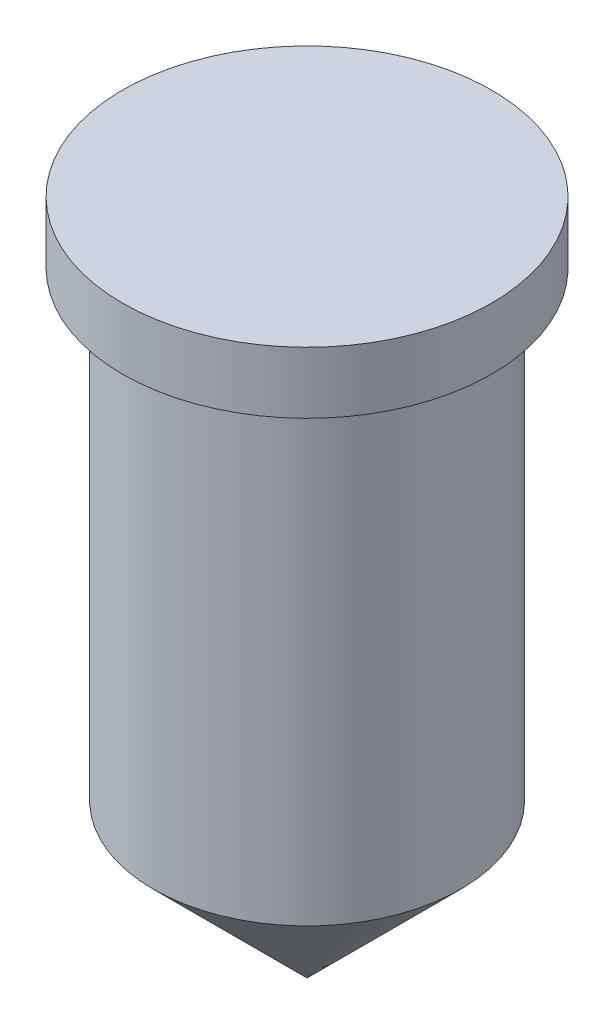
ISO-10303-21;
HEADER;
FILE_DESCRIPTION(('STEP AP214'),'2;1');
FILE_NAME('part.step','',(''),(''),'','','');
FILE_SCHEMA(('AUTOMOTIVE_DESIGN { 1 0 10303 214 1 1 1 1 }'));
ENDSEC;
DATA;
#1=APPLICATION_CONTEXT('core data for automotive mechanical design processes');
#2=APPLICATION_PROTOCOL_DEFINITION('international standard','automotive_design',2000,#1);
#3=PRODUCT_CONTEXT('',#1,'mechanical');
#4=PRODUCT('Part','Part','',(#3));
#5=PRODUCT_RELATED_PRODUCT_CATEGORY('part','',(#4));
#6=PRODUCT_DEFINITION_FORMATION('','',#4);
#7=PRODUCT_DEFINITION_CONTEXT('part definition',#1,'design');
#8=PRODUCT_DEFINITION('design','',#6,#7);
#9=PRODUCT_DEFINITION_SHAPE('','',#8);
#10=(LENGTH_UNIT() NAMED_UNIT(*) SI_UNIT(.MILLI.,.METRE.));
#11=(NAMED_UNIT(*) PLANE_ANGLE_UNIT() SI_UNIT($,.RADIAN.));
#12=(NAMED_UNIT(*) SI_UNIT($,.STERADIAN.) SOLID_ANGLE_UNIT());
#13=UNCERTAINTY_MEASURE_WITH_UNIT(LENGTH_MEASURE(1.E-05),#10,'distance_accuracy_value','');
#14=(GEOMETRIC_REPRESENTATION_CONTEXT(3) GLOBAL_UNCERTAINTY_ASSIGNED_CONTEXT((#13)) GLOBAL_UNIT_ASSIGNED_CONTEXT((#10,
#11,#12)) REPRESENTATION_CONTEXT('',''));
#15=CARTESIAN_POINT('',(0.,0.,0.));
#16=DIRECTION('',(0.,0.,1.));
#17=DIRECTION('',(1.,0.,0.));
#18=AXIS2_PLACEMENT_3D('',#15,#16,#17);
#19=CARTESIAN_POINT('',(0.,10.,0.));
#20=DIRECTION('',(0.,-1.,0.));
#21=DIRECTION('',(0.,0.,-1.));
#22=AXIS2_PLACEMENT_3D('',#19,#20,#21);
#23=CYLINDRICAL_SURFACE('',#22,2.5);
#24=CARTESIAN_POINT('',(0.,2.5,0.));
#25=DIRECTION('',(0.,1.,0.));
#26=DIRECTION('',(0.,0.,1.));
#27=AXIS2_PLACEMENT_3D('',#24,#25,#26);
#28=CIRCLE('',#27,2.5);
#29=CARTESIAN_POINT('',(0.,2.5,2.5));
#30=VERTEX_POINT('',#29);
#31=EDGE_CURVE('E11',#30,#30,#28,.T.);
#32=ORIENTED_EDGE('',*,*,#31,.T.);
#33=EDGE_LOOP('',(#32));
#34=FACE_BOUND('',#33,.T.);
#35=CARTESIAN_POINT('',(0.,10.,0.));
#36=DIRECTION('',(0.,1.,0.));
#37=DIRECTION('',(0.,0.,1.));
#38=AXIS2_PLACEMENT_3D('',#35,#36,#37);
#39=CIRCLE('',#38,2.5);
#40=CARTESIAN_POINT('',(0.,10.,2.5));
#41=VERTEX_POINT('',#40);
#42=EDGE_CURVE('E49',#41,#41,#39,.T.);
#43=ORIENTED_EDGE('',*,*,#42,.F.);
#44=EDGE_LOOP('',(#43));
#45=FACE_BOUND('',#44,.T.);
#46=ADVANCED_FACE('F41',(#34,#45),#23,.T.);
#47=CARTESIAN_POINT('',(0.,2.5,0.));
#48=DIRECTION('',(0.,1.,0.));
#49=DIRECTION('',(0.,0.,1.));
#50=AXIS2_PLACEMENT_3D('',#47,#48,#49);
#51=CONICAL_SURFACE('',#50,2.50000000000001,0.78539816339745);
#52=CARTESIAN_POINT('',(0.,0.,0.));
#53=VERTEX_POINT('',#52);
#54=VERTEX_LOOP('',#53);
#55=FACE_BOUND('',#54,.T.);
#56=ORIENTED_EDGE('',*,*,#31,.F.);
#57=EDGE_LOOP('',(#56));
#58=FACE_BOUND('',#57,.T.);
#59=ADVANCED_FACE('F44',(#55,#58),#51,.T.);
#60=CARTESIAN_POINT('',(0.,11.,0.));
#61=DIRECTION('',(0.,-1.,0.));
#62=DIRECTION('',(0.,0.,-1.));
#63=AXIS2_PLACEMENT_3D('',#60,#61,#62);
#64=CYLINDRICAL_SURFACE('',#63,3.);
#65=CARTESIAN_POINT('',(0.,11.,0.));
#66=DIRECTION('',(0.,1.,0.));
#67=DIRECTION('',(0.,0.,1.));
#68=AXIS2_PLACEMENT_3D('',#65,#66,#67);
#69=CIRCLE('',#68,3.);
#70=CARTESIAN_POINT('',(0.,11.,3.));
#71=VERTEX_POINT('',#70);
#72=EDGE_CURVE('E62',#71,#71,#69,.T.);
#73=ORIENTED_EDGE('',*,*,#72,.F.);
#74=EDGE_LOOP('',(#73));
#75=FACE_BOUND('',#74,.T.);
#76=CARTESIAN_POINT('',(0.,10.,0.));
#77=DIRECTION('',(0.,1.,0.));
#78=DIRECTION('',(0.,0.,1.));
#79=AXIS2_PLACEMENT_3D('',#76,#77,#78);
#80=CIRCLE('',#79,3.);
#81=CARTESIAN_POINT('',(0.,10.,3.));
#82=VERTEX_POINT('',#81);
#83=EDGE_CURVE('E64',#82,#82,#80,.T.);
#84=ORIENTED_EDGE('',*,*,#83,.T.);
#85=EDGE_LOOP('',(#84));
#86=FACE_BOUND('',#85,.T.);
#87=ADVANCED_FACE('F54',(#75,#86),#64,.T.);
#88=CARTESIAN_POINT('',(0.,11.,0.));
#89=DIRECTION('',(0.,1.,0.));
#90=DIRECTION('',(0.,0.,1.));
#91=AXIS2_PLACEMENT_3D('',#88,#89,#90);
#92=PLANE('',#91);
#93=ORIENTED_EDGE('',*,*,#72,.T.);
#94=EDGE_LOOP('',(#93));
#95=FACE_BOUND('',#94,.T.);
#96=ADVANCED_FACE('F73',(#95),#92,.T.);
#97=CARTESIAN_POINT('',(0.,10.,0.));
#98=DIRECTION('',(0.,1.,0.));
#99=DIRECTION('',(0.,0.,1.));
#100=AXIS2_PLACEMENT_3D('',#97,#98,#99);
#101=PLANE('',#100);
#102=ORIENTED_EDGE('',*,*,#42,.T.);
#103=EDGE_LOOP('',(#102));
#104=FACE_BOUND('',#103,.T.);
#105=ORIENTED_EDGE('',*,*,#83,.F.);
#106=EDGE_LOOP('',(#105));
#107=FACE_BOUND('',#106,.T.);
#108=ADVANCED_FACE('F71',(#104,#107),#101,.F.);
#109=CLOSED_SHELL('',(#46,#59,#87,#96,#108));
#110=MANIFOLD_SOLID_BREP('B2',#109);
#111=ADVANCED_BREP_SHAPE_REPRESENTATION('',(#18,#110),#14);
#112=SHAPE_DEFINITION_REPRESENTATION(#9,#111);
ENDSEC;
END-ISO-10303-21;
